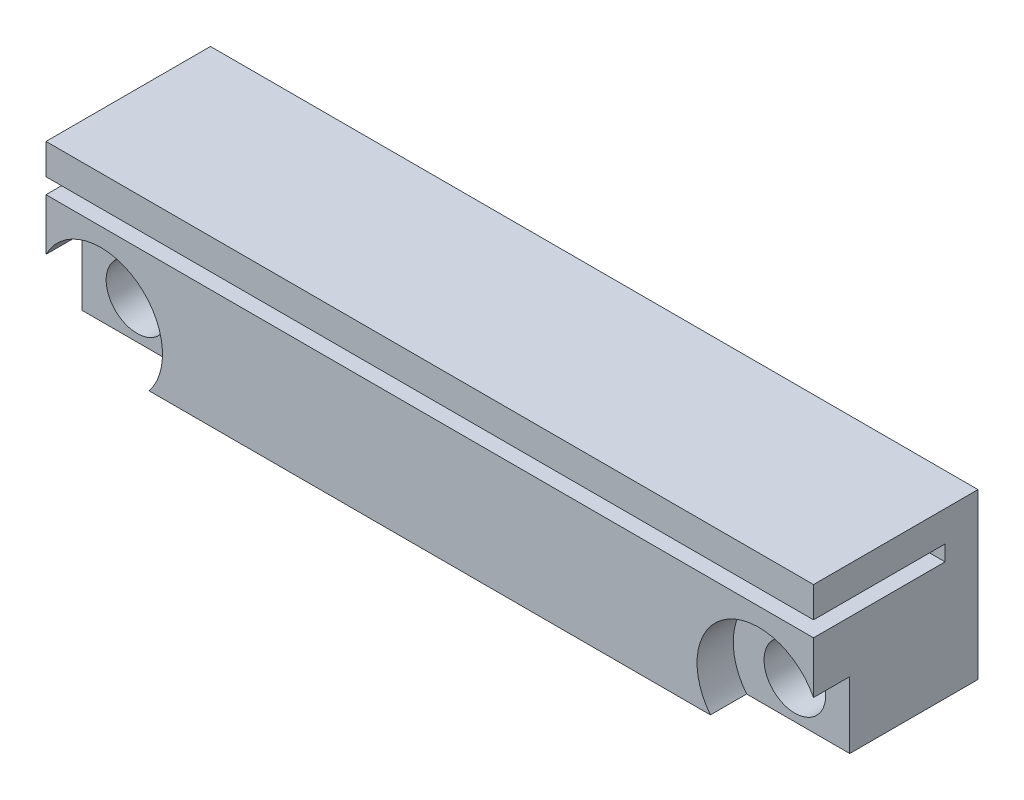
ISO-10303-21;
HEADER;
FILE_DESCRIPTION(('STEP AP214'),'2;1');
FILE_NAME('part.step','',(''),(''),'','','');
FILE_SCHEMA(('AUTOMOTIVE_DESIGN { 1 0 10303 214 1 1 1 1 }'));
ENDSEC;
DATA;
#1=APPLICATION_CONTEXT('core data for automotive mechanical design processes');
#2=APPLICATION_PROTOCOL_DEFINITION('international standard','automotive_design',2000,#1);
#3=PRODUCT_CONTEXT('',#1,'mechanical');
#4=PRODUCT('Part','Part','',(#3));
#5=PRODUCT_RELATED_PRODUCT_CATEGORY('part','',(#4));
#6=PRODUCT_DEFINITION_FORMATION('','',#4);
#7=PRODUCT_DEFINITION_CONTEXT('part definition',#1,'design');
#8=PRODUCT_DEFINITION('design','',#6,#7);
#9=PRODUCT_DEFINITION_SHAPE('','',#8);
#10=(LENGTH_UNIT() NAMED_UNIT(*) SI_UNIT(.MILLI.,.METRE.));
#11=(NAMED_UNIT(*) PLANE_ANGLE_UNIT() SI_UNIT($,.RADIAN.));
#12=(NAMED_UNIT(*) SI_UNIT($,.STERADIAN.) SOLID_ANGLE_UNIT());
#13=UNCERTAINTY_MEASURE_WITH_UNIT(LENGTH_MEASURE(1.E-05),#10,'distance_accuracy_value','');
#14=(GEOMETRIC_REPRESENTATION_CONTEXT(3) GLOBAL_UNCERTAINTY_ASSIGNED_CONTEXT((#13)) GLOBAL_UNIT_ASSIGNED_CONTEXT((#10,
#11,#12)) REPRESENTATION_CONTEXT('',''));
#15=CARTESIAN_POINT('',(0.,0.,0.));
#16=DIRECTION('',(0.,0.,1.));
#17=DIRECTION('',(1.,0.,0.));
#18=AXIS2_PLACEMENT_3D('',#15,#16,#17);
#19=CARTESIAN_POINT('',(44.45,9.525,19.05));
#20=DIRECTION('',(-1.,0.,0.));
#21=DIRECTION('',(0.,0.,1.));
#22=AXIS2_PLACEMENT_3D('',#19,#20,#21);
#23=PLANE('',#22);
#24=DIRECTION('',(0.,-1.,0.));
#25=VECTOR('',#24,1.);
#26=CARTESIAN_POINT('',(44.45,9.525,14.859));
#27=LINE('',#26,#25);
#28=CARTESIAN_POINT('',(44.45,-1.80728490966599,14.859));
#29=VERTEX_POINT('',#28);
#30=CARTESIAN_POINT('',(44.45,-9.525,14.859));
#31=VERTEX_POINT('',#30);
#32=EDGE_CURVE('E91',#29,#31,#27,.T.);
#33=ORIENTED_EDGE('',*,*,#32,.T.);
#34=DIRECTION('',(0.,0.,-1.));
#35=VECTOR('',#34,1.);
#36=CARTESIAN_POINT('',(44.45,-9.525,19.05));
#37=LINE('',#36,#35);
#38=CARTESIAN_POINT('',(44.45,-9.525,0.));
#39=VERTEX_POINT('',#38);
#40=EDGE_CURVE('E83',#31,#39,#37,.T.);
#41=ORIENTED_EDGE('',*,*,#40,.T.);
#42=DIRECTION('',(0.,1.,0.));
#43=VECTOR('',#42,1.);
#44=CARTESIAN_POINT('',(44.45,9.525,0.));
#45=LINE('',#44,#43);
#46=CARTESIAN_POINT('',(44.45,9.525,0.));
#47=VERTEX_POINT('',#46);
#48=EDGE_CURVE('E87',#39,#47,#45,.T.);
#49=ORIENTED_EDGE('',*,*,#48,.T.);
#50=DIRECTION('',(0.,0.,-1.));
#51=VECTOR('',#50,1.);
#52=CARTESIAN_POINT('',(44.45,9.525,19.05));
#53=LINE('',#52,#51);
#54=CARTESIAN_POINT('',(44.45,9.525,19.05));
#55=VERTEX_POINT('',#54);
#56=EDGE_CURVE('E134',#55,#47,#53,.T.);
#57=ORIENTED_EDGE('',*,*,#56,.F.);
#58=DIRECTION('',(0.,1.,0.));
#59=VECTOR('',#58,1.);
#60=CARTESIAN_POINT('',(44.45,9.525,19.05));
#61=LINE('',#60,#59);
#62=CARTESIAN_POINT('',(44.45,5.98,19.05));
#63=VERTEX_POINT('',#62);
#64=EDGE_CURVE('E108',#63,#55,#61,.T.);
#65=ORIENTED_EDGE('',*,*,#64,.F.);
#66=DIRECTION('',(0.,0.,-1.));
#67=VECTOR('',#66,1.);
#68=CARTESIAN_POINT('',(44.45,5.98,19.05));
#69=LINE('',#68,#67);
#70=CARTESIAN_POINT('',(44.45,5.98,3.81));
#71=VERTEX_POINT('',#70);
#72=EDGE_CURVE('E226',#63,#71,#69,.T.);
#73=ORIENTED_EDGE('',*,*,#72,.T.);
#74=DIRECTION('',(0.,1.,0.));
#75=VECTOR('',#74,1.);
#76=CARTESIAN_POINT('',(44.45,9.525,3.81));
#77=LINE('',#76,#75);
#78=CARTESIAN_POINT('',(44.45,4.18,3.81));
#79=VERTEX_POINT('',#78);
#80=EDGE_CURVE('E230',#79,#71,#77,.T.);
#81=ORIENTED_EDGE('',*,*,#80,.F.);
#82=DIRECTION('',(0.,0.,1.));
#83=VECTOR('',#82,1.);
#84=CARTESIAN_POINT('',(44.45,4.18,19.05));
#85=LINE('',#84,#83);
#86=CARTESIAN_POINT('',(44.45,4.18,19.05));
#87=VERTEX_POINT('',#86);
#88=EDGE_CURVE('E219',#79,#87,#85,.T.);
#89=ORIENTED_EDGE('',*,*,#88,.T.);
#90=CARTESIAN_POINT('',(44.45,-1.80728490966599,19.05));
#91=VERTEX_POINT('',#90);
#92=EDGE_CURVE('E181',#91,#87,#61,.T.);
#93=ORIENTED_EDGE('',*,*,#92,.F.);
#94=DIRECTION('',(0.,0.,1.));
#95=VECTOR('',#94,1.);
#96=CARTESIAN_POINT('',(44.45,-1.80728490966599,19.05));
#97=LINE('',#96,#95);
#98=EDGE_CURVE('E137',#91,#29,#97,.F.);
#99=ORIENTED_EDGE('',*,*,#98,.T.);
#100=EDGE_LOOP('',(#33,#41,#49,#57,#65,#73,#81,#89,#93,#99));
#101=FACE_BOUND('',#100,.T.);
#102=ADVANCED_FACE('F39',(#101),#23,.F.);
#103=CARTESIAN_POINT('',(-44.45,9.525,19.05));
#104=DIRECTION('',(1.,0.,0.));
#105=DIRECTION('',(0.,0.,-1.));
#106=AXIS2_PLACEMENT_3D('',#103,#104,#105);
#107=PLANE('',#106);
#108=DIRECTION('',(0.,0.,-1.));
#109=VECTOR('',#108,1.);
#110=CARTESIAN_POINT('',(-44.45,-9.525,19.05));
#111=LINE('',#110,#109);
#112=CARTESIAN_POINT('',(-44.45,-9.525,14.859));
#113=VERTEX_POINT('',#112);
#114=CARTESIAN_POINT('',(-44.45,-9.525,0.));
#115=VERTEX_POINT('',#114);
#116=EDGE_CURVE('E96',#113,#115,#111,.T.);
#117=ORIENTED_EDGE('',*,*,#116,.F.);
#118=DIRECTION('',(0.,1.,0.));
#119=VECTOR('',#118,1.);
#120=CARTESIAN_POINT('',(-44.45,9.525,14.859));
#121=LINE('',#120,#119);
#122=CARTESIAN_POINT('',(-44.45,-1.80728490966598,14.859));
#123=VERTEX_POINT('',#122);
#124=EDGE_CURVE('E203',#113,#123,#121,.T.);
#125=ORIENTED_EDGE('',*,*,#124,.T.);
#126=DIRECTION('',(0.,0.,1.));
#127=VECTOR('',#126,1.);
#128=CARTESIAN_POINT('',(-44.45,-1.80728490966597,19.05));
#129=LINE('',#128,#127);
#130=CARTESIAN_POINT('',(-44.45,-1.80728490966597,19.05));
#131=VERTEX_POINT('',#130);
#132=EDGE_CURVE('E199',#123,#131,#129,.T.);
#133=ORIENTED_EDGE('',*,*,#132,.T.);
#134=DIRECTION('',(0.,-1.,0.));
#135=VECTOR('',#134,1.);
#136=CARTESIAN_POINT('',(-44.45,9.525,19.05));
#137=LINE('',#136,#135);
#138=CARTESIAN_POINT('',(-44.45,4.18,19.05));
#139=VERTEX_POINT('',#138);
#140=EDGE_CURVE('E173',#139,#131,#137,.T.);
#141=ORIENTED_EDGE('',*,*,#140,.F.);
#142=DIRECTION('',(0.,0.,-1.));
#143=VECTOR('',#142,1.);
#144=CARTESIAN_POINT('',(-44.45,4.18,19.05));
#145=LINE('',#144,#143);
#146=CARTESIAN_POINT('',(-44.45,4.18,3.81));
#147=VERTEX_POINT('',#146);
#148=EDGE_CURVE('E11',#139,#147,#145,.T.);
#149=ORIENTED_EDGE('',*,*,#148,.T.);
#150=DIRECTION('',(0.,-1.,0.));
#151=VECTOR('',#150,1.);
#152=CARTESIAN_POINT('',(-44.45,9.525,3.81));
#153=LINE('',#152,#151);
#154=CARTESIAN_POINT('',(-44.45,5.98,3.81));
#155=VERTEX_POINT('',#154);
#156=EDGE_CURVE('E153',#155,#147,#153,.T.);
#157=ORIENTED_EDGE('',*,*,#156,.F.);
#158=DIRECTION('',(0.,0.,1.));
#159=VECTOR('',#158,1.);
#160=CARTESIAN_POINT('',(-44.45,5.98,19.05));
#161=LINE('',#160,#159);
#162=CARTESIAN_POINT('',(-44.45,5.98,19.05));
#163=VERTEX_POINT('',#162);
#164=EDGE_CURVE('E47',#155,#163,#161,.T.);
#165=ORIENTED_EDGE('',*,*,#164,.T.);
#166=CARTESIAN_POINT('',(-44.45,9.525,19.05));
#167=VERTEX_POINT('',#166);
#168=EDGE_CURVE('E162',#167,#163,#137,.T.);
#169=ORIENTED_EDGE('',*,*,#168,.F.);
#170=DIRECTION('',(0.,0.,-1.));
#171=VECTOR('',#170,1.);
#172=CARTESIAN_POINT('',(-44.45,9.525,19.05));
#173=LINE('',#172,#171);
#174=CARTESIAN_POINT('',(-44.45,9.525,0.));
#175=VERTEX_POINT('',#174);
#176=EDGE_CURVE('E130',#167,#175,#173,.T.);
#177=ORIENTED_EDGE('',*,*,#176,.T.);
#178=DIRECTION('',(0.,-1.,0.));
#179=VECTOR('',#178,1.);
#180=CARTESIAN_POINT('',(-44.45,9.525,0.));
#181=LINE('',#180,#179);
#182=EDGE_CURVE('E109',#175,#115,#181,.T.);
#183=ORIENTED_EDGE('',*,*,#182,.T.);
#184=EDGE_LOOP('',(#117,#125,#133,#141,#149,#157,#165,#169,#177,#183));
#185=FACE_BOUND('',#184,.T.);
#186=ADVANCED_FACE('F161',(#185),#107,.F.);
#187=CARTESIAN_POINT('',(-44.45,-9.525,19.05));
#188=DIRECTION('',(0.,1.,0.));
#189=DIRECTION('',(0.,0.,1.));
#190=AXIS2_PLACEMENT_3D('',#187,#188,#189);
#191=PLANE('',#190);
#192=DIRECTION('',(-1.,0.,0.));
#193=VECTOR('',#192,1.);
#194=CARTESIAN_POINT('',(-44.45,-9.525,14.859));
#195=LINE('',#194,#193);
#196=CARTESIAN_POINT('',(-32.5075820021658,-9.525,14.859));
#197=VERTEX_POINT('',#196);
#198=EDGE_CURVE('E145',#197,#113,#195,.T.);
#199=ORIENTED_EDGE('',*,*,#198,.T.);
#200=ORIENTED_EDGE('',*,*,#116,.T.);
#201=DIRECTION('',(1.,0.,0.));
#202=VECTOR('',#201,1.);
#203=CARTESIAN_POINT('',(-44.45,-9.525,0.));
#204=LINE('',#203,#202);
#205=EDGE_CURVE('E100',#115,#39,#204,.T.);
#206=ORIENTED_EDGE('',*,*,#205,.T.);
#207=ORIENTED_EDGE('',*,*,#40,.F.);
#208=DIRECTION('',(-1.,0.,0.));
#209=VECTOR('',#208,1.);
#210=CARTESIAN_POINT('',(-44.45,-9.525,14.859));
#211=LINE('',#210,#209);
#212=CARTESIAN_POINT('',(32.5075820021658,-9.525,14.859));
#213=VERTEX_POINT('',#212);
#214=EDGE_CURVE('E142',#31,#213,#211,.T.);
#215=ORIENTED_EDGE('',*,*,#214,.T.);
#216=DIRECTION('',(0.,0.,1.));
#217=VECTOR('',#216,1.);
#218=CARTESIAN_POINT('',(32.5075820021658,-9.525,19.05));
#219=LINE('',#218,#217);
#220=CARTESIAN_POINT('',(32.5075820021658,-9.525,19.05));
#221=VERTEX_POINT('',#220);
#222=EDGE_CURVE('E115',#213,#221,#219,.T.);
#223=ORIENTED_EDGE('',*,*,#222,.T.);
#224=DIRECTION('',(1.,0.,0.));
#225=VECTOR('',#224,1.);
#226=CARTESIAN_POINT('',(-44.45,-9.525,19.05));
#227=LINE('',#226,#225);
#228=CARTESIAN_POINT('',(-32.5075820021658,-9.525,19.05));
#229=VERTEX_POINT('',#228);
#230=EDGE_CURVE('E97',#229,#221,#227,.T.);
#231=ORIENTED_EDGE('',*,*,#230,.F.);
#232=DIRECTION('',(0.,0.,1.));
#233=VECTOR('',#232,1.);
#234=CARTESIAN_POINT('',(-32.5075820021658,-9.525,19.05));
#235=LINE('',#234,#233);
#236=EDGE_CURVE('E148',#229,#197,#235,.F.);
#237=ORIENTED_EDGE('',*,*,#236,.T.);
#238=EDGE_LOOP('',(#199,#200,#206,#207,#215,#223,#231,#237));
#239=FACE_BOUND('',#238,.T.);
#240=ADVANCED_FACE('F102',(#239),#191,.F.);
#241=CARTESIAN_POINT('',(0.,0.,19.05));
#242=DIRECTION('',(0.,0.,1.));
#243=DIRECTION('',(1.,0.,0.));
#244=AXIS2_PLACEMENT_3D('',#241,#242,#243);
#245=PLANE('',#244);
#246=DIRECTION('',(1.,0.,0.));
#247=VECTOR('',#246,1.);
#248=CARTESIAN_POINT('',(-49.1337170017609,4.18,19.05));
#249=LINE('',#248,#247);
#250=EDGE_CURVE('E234',#139,#87,#249,.T.);
#251=ORIENTED_EDGE('',*,*,#250,.F.);
#252=ORIENTED_EDGE('',*,*,#140,.T.);
#253=CARTESIAN_POINT('',(-38.1,-5.08,19.05));
#254=DIRECTION('',(0.,0.,1.));
#255=DIRECTION('',(1.,0.,0.));
#256=AXIS2_PLACEMENT_3D('',#253,#254,#255);
#257=CIRCLE('',#256,7.14375);
#258=EDGE_CURVE('E152',#229,#131,#257,.T.);
#259=ORIENTED_EDGE('',*,*,#258,.F.);
#260=ORIENTED_EDGE('',*,*,#230,.T.);
#261=CARTESIAN_POINT('',(38.1,-5.08000000000001,19.05));
#262=DIRECTION('',(0.,0.,1.));
#263=DIRECTION('',(1.,0.,0.));
#264=AXIS2_PLACEMENT_3D('',#261,#262,#263);
#265=CIRCLE('',#264,7.14375);
#266=EDGE_CURVE('E195',#91,#221,#265,.T.);
#267=ORIENTED_EDGE('',*,*,#266,.F.);
#268=ORIENTED_EDGE('',*,*,#92,.T.);
#269=EDGE_LOOP('',(#251,#252,#259,#260,#267,#268));
#270=FACE_BOUND('',#269,.T.);
#271=ADVANCED_FACE('F320',(#270),#245,.T.);
#272=DIRECTION('',(-1.,0.,0.));
#273=VECTOR('',#272,1.);
#274=CARTESIAN_POINT('',(-49.1337170017609,5.98,19.05));
#275=LINE('',#274,#273);
#276=EDGE_CURVE('E170',#63,#163,#275,.T.);
#277=ORIENTED_EDGE('',*,*,#276,.F.);
#278=ORIENTED_EDGE('',*,*,#64,.T.);
#279=DIRECTION('',(-1.,0.,0.));
#280=VECTOR('',#279,1.);
#281=CARTESIAN_POINT('',(-44.45,9.525,19.05));
#282=LINE('',#281,#280);
#283=EDGE_CURVE('E63',#55,#167,#282,.T.);
#284=ORIENTED_EDGE('',*,*,#283,.T.);
#285=ORIENTED_EDGE('',*,*,#168,.T.);
#286=EDGE_LOOP('',(#277,#278,#284,#285));
#287=FACE_BOUND('',#286,.T.);
#288=ADVANCED_FACE('F169',(#287),#245,.T.);
#289=CARTESIAN_POINT('',(-44.45,9.525,19.05));
#290=DIRECTION('',(0.,-1.,0.));
#291=DIRECTION('',(0.,0.,-1.));
#292=AXIS2_PLACEMENT_3D('',#289,#290,#291);
#293=PLANE('',#292);
#294=DIRECTION('',(-1.,0.,0.));
#295=VECTOR('',#294,1.);
#296=CARTESIAN_POINT('',(-44.45,9.525,0.));
#297=LINE('',#296,#295);
#298=EDGE_CURVE('E112',#47,#175,#297,.T.);
#299=ORIENTED_EDGE('',*,*,#298,.T.);
#300=ORIENTED_EDGE('',*,*,#176,.F.);
#301=ORIENTED_EDGE('',*,*,#283,.F.);
#302=ORIENTED_EDGE('',*,*,#56,.T.);
#303=EDGE_LOOP('',(#299,#300,#301,#302));
#304=FACE_BOUND('',#303,.T.);
#305=ADVANCED_FACE('F323',(#304),#293,.F.);
#306=CARTESIAN_POINT('',(0.,0.,0.));
#307=DIRECTION('',(0.,0.,1.));
#308=DIRECTION('',(1.,0.,0.));
#309=AXIS2_PLACEMENT_3D('',#306,#307,#308);
#310=PLANE('',#309);
#311=CARTESIAN_POINT('',(-38.1,-5.08,0.));
#312=DIRECTION('',(0.,0.,1.));
#313=DIRECTION('',(1.,0.,0.));
#314=AXIS2_PLACEMENT_3D('',#311,#312,#313);
#315=CIRCLE('',#314,3.57124);
#316=CARTESIAN_POINT('',(-34.52876,-5.08,0.));
#317=VERTEX_POINT('',#316);
#318=EDGE_CURVE('E207',#317,#317,#315,.T.);
#319=ORIENTED_EDGE('',*,*,#318,.T.);
#320=EDGE_LOOP('',(#319));
#321=FACE_BOUND('',#320,.T.);
#322=CARTESIAN_POINT('',(38.1,-5.08000000000001,0.));
#323=DIRECTION('',(0.,0.,1.));
#324=DIRECTION('',(1.,0.,0.));
#325=AXIS2_PLACEMENT_3D('',#322,#323,#324);
#326=CIRCLE('',#325,3.57124);
#327=CARTESIAN_POINT('',(41.67124,-5.08000000000001,0.));
#328=VERTEX_POINT('',#327);
#329=EDGE_CURVE('E121',#328,#328,#326,.T.);
#330=ORIENTED_EDGE('',*,*,#329,.T.);
#331=EDGE_LOOP('',(#330));
#332=FACE_BOUND('',#331,.T.);
#333=ORIENTED_EDGE('',*,*,#48,.F.);
#334=ORIENTED_EDGE('',*,*,#205,.F.);
#335=ORIENTED_EDGE('',*,*,#182,.F.);
#336=ORIENTED_EDGE('',*,*,#298,.F.);
#337=EDGE_LOOP('',(#333,#334,#335,#336));
#338=FACE_BOUND('',#337,.T.);
#339=ADVANCED_FACE('F111',(#321,#332,#338),#310,.F.);
#340=CARTESIAN_POINT('',(41.67124,-5.08000000000001,14.859));
#341=DIRECTION('',(0.,0.,-1.));
#342=DIRECTION('',(-1.,0.,0.));
#343=AXIS2_PLACEMENT_3D('',#340,#341,#342);
#344=PLANE('',#343);
#345=CARTESIAN_POINT('',(38.1,-5.08000000000001,14.859));
#346=DIRECTION('',(0.,0.,1.));
#347=DIRECTION('',(1.,0.,0.));
#348=AXIS2_PLACEMENT_3D('',#345,#346,#347);
#349=CIRCLE('',#348,7.14375);
#350=EDGE_CURVE('E191',#29,#213,#349,.T.);
#351=ORIENTED_EDGE('',*,*,#350,.T.);
#352=ORIENTED_EDGE('',*,*,#214,.F.);
#353=ORIENTED_EDGE('',*,*,#32,.F.);
#354=EDGE_LOOP('',(#351,#352,#353));
#355=FACE_BOUND('',#354,.T.);
#356=CARTESIAN_POINT('',(38.1,-5.08000000000001,14.859));
#357=DIRECTION('',(0.,0.,1.));
#358=DIRECTION('',(1.,0.,0.));
#359=AXIS2_PLACEMENT_3D('',#356,#357,#358);
#360=CIRCLE('',#359,3.57124);
#361=CARTESIAN_POINT('',(41.67124,-5.08000000000001,14.859));
#362=VERTEX_POINT('',#361);
#363=EDGE_CURVE('E187',#362,#362,#360,.T.);
#364=ORIENTED_EDGE('',*,*,#363,.F.);
#365=EDGE_LOOP('',(#364));
#366=FACE_BOUND('',#365,.T.);
#367=ADVANCED_FACE('F291',(#355,#366),#344,.F.);
#368=CARTESIAN_POINT('',(38.1,-5.08000000000001,19.05));
#369=DIRECTION('',(0.,0.,1.));
#370=DIRECTION('',(1.,0.,0.));
#371=AXIS2_PLACEMENT_3D('',#368,#369,#370);
#372=CYLINDRICAL_SURFACE('',#371,7.14375);
#373=ORIENTED_EDGE('',*,*,#350,.F.);
#374=ORIENTED_EDGE('',*,*,#98,.F.);
#375=ORIENTED_EDGE('',*,*,#266,.T.);
#376=ORIENTED_EDGE('',*,*,#222,.F.);
#377=EDGE_LOOP('',(#373,#374,#375,#376));
#378=FACE_BOUND('',#377,.T.);
#379=ADVANCED_FACE('F289',(#378),#372,.F.);
#380=CARTESIAN_POINT('',(38.1,-5.08000000000001,19.05));
#381=DIRECTION('',(0.,0.,1.));
#382=DIRECTION('',(1.,0.,0.));
#383=AXIS2_PLACEMENT_3D('',#380,#381,#382);
#384=CYLINDRICAL_SURFACE('',#383,3.57124);
#385=ORIENTED_EDGE('',*,*,#329,.F.);
#386=EDGE_LOOP('',(#385));
#387=FACE_BOUND('',#386,.T.);
#388=ORIENTED_EDGE('',*,*,#363,.T.);
#389=EDGE_LOOP('',(#388));
#390=FACE_BOUND('',#389,.T.);
#391=ADVANCED_FACE('F297',(#387,#390),#384,.F.);
#392=CARTESIAN_POINT('',(-38.1,-5.08,19.05));
#393=DIRECTION('',(0.,0.,1.));
#394=DIRECTION('',(1.,0.,0.));
#395=AXIS2_PLACEMENT_3D('',#392,#393,#394);
#396=CYLINDRICAL_SURFACE('',#395,7.14375);
#397=CARTESIAN_POINT('',(-38.1,-5.08,14.859));
#398=DIRECTION('',(0.,0.,1.));
#399=DIRECTION('',(1.,0.,0.));
#400=AXIS2_PLACEMENT_3D('',#397,#398,#399);
#401=CIRCLE('',#400,7.14375);
#402=EDGE_CURVE('E215',#197,#123,#401,.T.);
#403=ORIENTED_EDGE('',*,*,#402,.F.);
#404=ORIENTED_EDGE('',*,*,#236,.F.);
#405=ORIENTED_EDGE('',*,*,#258,.T.);
#406=ORIENTED_EDGE('',*,*,#132,.F.);
#407=EDGE_LOOP('',(#403,#404,#405,#406));
#408=FACE_BOUND('',#407,.T.);
#409=ADVANCED_FACE('F299',(#408),#396,.F.);
#410=CARTESIAN_POINT('',(-34.52876,-5.08,14.859));
#411=DIRECTION('',(0.,0.,-1.));
#412=DIRECTION('',(-1.,0.,0.));
#413=AXIS2_PLACEMENT_3D('',#410,#411,#412);
#414=PLANE('',#413);
#415=ORIENTED_EDGE('',*,*,#402,.T.);
#416=ORIENTED_EDGE('',*,*,#124,.F.);
#417=ORIENTED_EDGE('',*,*,#198,.F.);
#418=EDGE_LOOP('',(#415,#416,#417));
#419=FACE_BOUND('',#418,.T.);
#420=CARTESIAN_POINT('',(-38.1,-5.08,14.859));
#421=DIRECTION('',(0.,0.,1.));
#422=DIRECTION('',(1.,0.,0.));
#423=AXIS2_PLACEMENT_3D('',#420,#421,#422);
#424=CIRCLE('',#423,3.57124);
#425=CARTESIAN_POINT('',(-34.52876,-5.08,14.859));
#426=VERTEX_POINT('',#425);
#427=EDGE_CURVE('E211',#426,#426,#424,.T.);
#428=ORIENTED_EDGE('',*,*,#427,.F.);
#429=EDGE_LOOP('',(#428));
#430=FACE_BOUND('',#429,.T.);
#431=ADVANCED_FACE('F306',(#419,#430),#414,.F.);
#432=CARTESIAN_POINT('',(-38.1,-5.08,19.05));
#433=DIRECTION('',(0.,0.,1.));
#434=DIRECTION('',(1.,0.,0.));
#435=AXIS2_PLACEMENT_3D('',#432,#433,#434);
#436=CYLINDRICAL_SURFACE('',#435,3.57124);
#437=ORIENTED_EDGE('',*,*,#318,.F.);
#438=EDGE_LOOP('',(#437));
#439=FACE_BOUND('',#438,.T.);
#440=ORIENTED_EDGE('',*,*,#427,.T.);
#441=EDGE_LOOP('',(#440));
#442=FACE_BOUND('',#441,.T.);
#443=ADVANCED_FACE('F342',(#439,#442),#436,.F.);
#444=CARTESIAN_POINT('',(-49.1337170017609,4.18,3.81));
#445=DIRECTION('',(0.,-1.,0.));
#446=DIRECTION('',(0.,0.,-1.));
#447=AXIS2_PLACEMENT_3D('',#444,#445,#446);
#448=PLANE('',#447);
#449=DIRECTION('',(1.,0.,0.));
#450=VECTOR('',#449,1.);
#451=CARTESIAN_POINT('',(-49.1337170017609,4.18,3.81));
#452=LINE('',#451,#450);
#453=EDGE_CURVE('E233',#147,#79,#452,.T.);
#454=ORIENTED_EDGE('',*,*,#453,.F.);
#455=ORIENTED_EDGE('',*,*,#148,.F.);
#456=ORIENTED_EDGE('',*,*,#250,.T.);
#457=ORIENTED_EDGE('',*,*,#88,.F.);
#458=EDGE_LOOP('',(#454,#455,#456,#457));
#459=FACE_BOUND('',#458,.T.);
#460=ADVANCED_FACE('F340',(#459),#448,.F.);
#461=CARTESIAN_POINT('',(-49.1337170017609,5.98,3.81));
#462=DIRECTION('',(0.,1.,0.));
#463=DIRECTION('',(0.,0.,1.));
#464=AXIS2_PLACEMENT_3D('',#461,#462,#463);
#465=PLANE('',#464);
#466=ORIENTED_EDGE('',*,*,#276,.T.);
#467=ORIENTED_EDGE('',*,*,#164,.F.);
#468=DIRECTION('',(-1.,0.,0.));
#469=VECTOR('',#468,1.);
#470=CARTESIAN_POINT('',(-49.1337170017609,5.98,3.81));
#471=LINE('',#470,#469);
#472=EDGE_CURVE('E54',#71,#155,#471,.T.);
#473=ORIENTED_EDGE('',*,*,#472,.F.);
#474=ORIENTED_EDGE('',*,*,#72,.F.);
#475=EDGE_LOOP('',(#466,#467,#473,#474));
#476=FACE_BOUND('',#475,.T.);
#477=ADVANCED_FACE('F260',(#476),#465,.F.);
#478=CARTESIAN_POINT('',(0.,0.,3.81));
#479=DIRECTION('',(0.,0.,1.));
#480=DIRECTION('',(1.,0.,0.));
#481=AXIS2_PLACEMENT_3D('',#478,#479,#480);
#482=PLANE('',#481);
#483=ORIENTED_EDGE('',*,*,#80,.T.);
#484=ORIENTED_EDGE('',*,*,#472,.T.);
#485=ORIENTED_EDGE('',*,*,#156,.T.);
#486=ORIENTED_EDGE('',*,*,#453,.T.);
#487=EDGE_LOOP('',(#483,#484,#485,#486));
#488=FACE_BOUND('',#487,.T.);
#489=ADVANCED_FACE('F247',(#488),#482,.T.);
#490=CLOSED_SHELL('',(#102,#186,#240,#271,#288,#305,#339,#367,#379,#391,#409,#431,#443,#460,
#477,#489));
#491=MANIFOLD_SOLID_BREP('B2',#490);
#492=ADVANCED_BREP_SHAPE_REPRESENTATION('',(#18,#491),#14);
#493=SHAPE_DEFINITION_REPRESENTATION(#9,#492);
ENDSEC;
END-ISO-10303-21;
